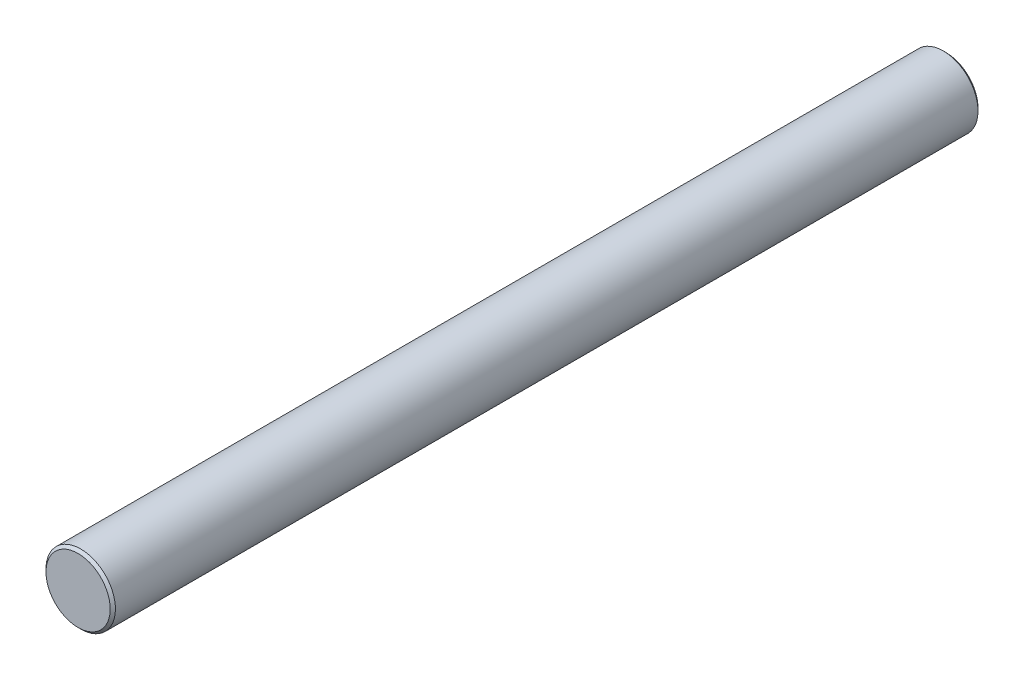
ISO-10303-21;
HEADER;
FILE_DESCRIPTION(('STEP AP214'),'2;1');
FILE_NAME('part.step','',(''),(''),'','','');
FILE_SCHEMA(('AUTOMOTIVE_DESIGN { 1 0 10303 214 1 1 1 1 }'));
ENDSEC;
DATA;
#1=APPLICATION_CONTEXT('core data for automotive mechanical design processes');
#2=APPLICATION_PROTOCOL_DEFINITION('international standard','automotive_design',2000,#1);
#3=PRODUCT_CONTEXT('',#1,'mechanical');
#4=PRODUCT('Part','Part','',(#3));
#5=PRODUCT_RELATED_PRODUCT_CATEGORY('part','',(#4));
#6=PRODUCT_DEFINITION_FORMATION('','',#4);
#7=PRODUCT_DEFINITION_CONTEXT('part definition',#1,'design');
#8=PRODUCT_DEFINITION('design','',#6,#7);
#9=PRODUCT_DEFINITION_SHAPE('','',#8);
#10=(LENGTH_UNIT() NAMED_UNIT(*) SI_UNIT(.MILLI.,.METRE.));
#11=(NAMED_UNIT(*) PLANE_ANGLE_UNIT() SI_UNIT($,.RADIAN.));
#12=(NAMED_UNIT(*) SI_UNIT($,.STERADIAN.) SOLID_ANGLE_UNIT());
#13=UNCERTAINTY_MEASURE_WITH_UNIT(LENGTH_MEASURE(1.E-05),#10,'distance_accuracy_value','');
#14=(GEOMETRIC_REPRESENTATION_CONTEXT(3) GLOBAL_UNCERTAINTY_ASSIGNED_CONTEXT((#13)) GLOBAL_UNIT_ASSIGNED_CONTEXT((#10,
#11,#12)) REPRESENTATION_CONTEXT('',''));
#15=CARTESIAN_POINT('',(0.,0.,0.));
#16=DIRECTION('',(0.,0.,1.));
#17=DIRECTION('',(1.,0.,0.));
#18=AXIS2_PLACEMENT_3D('',#15,#16,#17);
#19=CARTESIAN_POINT('',(0.,9.25,0.));
#20=DIRECTION('',(0.,0.,-1.));
#21=DIRECTION('',(0.,1.,0.));
#22=AXIS2_PLACEMENT_3D('',#19,#20,#21);
#23=PLANE('',#22);
#24=CARTESIAN_POINT('',(0.,0.,0.));
#25=DIRECTION('',(0.,0.,-1.));
#26=DIRECTION('',(0.,1.,0.));
#27=AXIS2_PLACEMENT_3D('',#24,#25,#26);
#28=CIRCLE('',#27,18.5);
#29=CARTESIAN_POINT('',(0.,18.5,0.));
#30=VERTEX_POINT('',#29);
#31=EDGE_CURVE('E9',#30,#30,#28,.T.);
#32=ORIENTED_EDGE('',*,*,#31,.T.);
#33=EDGE_LOOP('',(#32));
#34=FACE_BOUND('',#33,.T.);
#35=CARTESIAN_POINT('',(0.,0.,0.));
#36=DIRECTION('',(0.,0.,1.));
#37=DIRECTION('',(-1.,0.,0.));
#38=AXIS2_PLACEMENT_3D('',#35,#36,#37);
#39=CIRCLE('',#38,6.);
#40=CARTESIAN_POINT('',(-6.,0.,0.));
#41=VERTEX_POINT('',#40);
#42=EDGE_CURVE('E52',#41,#41,#39,.T.);
#43=ORIENTED_EDGE('',*,*,#42,.T.);
#44=EDGE_LOOP('',(#43));
#45=FACE_BOUND('',#44,.T.);
#46=ADVANCED_FACE('F15',(#34,#45),#23,.T.);
#47=CARTESIAN_POINT('',(0.,0.,0.75));
#48=DIRECTION('',(0.,0.,1.));
#49=DIRECTION('',(0.,1.,0.));
#50=AXIS2_PLACEMENT_3D('',#47,#48,#49);
#51=CONICAL_SURFACE('',#50,19.25,0.785398163397448);
#52=CARTESIAN_POINT('',(0.,0.,1.5));
#53=DIRECTION('',(0.,0.,-1.));
#54=DIRECTION('',(0.,1.,0.));
#55=AXIS2_PLACEMENT_3D('',#52,#53,#54);
#56=CIRCLE('',#55,20.);
#57=CARTESIAN_POINT('',(0.,20.,1.5));
#58=VERTEX_POINT('',#57);
#59=EDGE_CURVE('E25',#58,#58,#56,.T.);
#60=ORIENTED_EDGE('',*,*,#59,.T.);
#61=EDGE_LOOP('',(#60));
#62=FACE_BOUND('',#61,.T.);
#63=ORIENTED_EDGE('',*,*,#31,.F.);
#64=EDGE_LOOP('',(#63));
#65=FACE_BOUND('',#64,.T.);
#66=ADVANCED_FACE('F120',(#62,#65),#51,.T.);
#67=CARTESIAN_POINT('',(0.,0.,250.));
#68=DIRECTION('',(0.,0.,1.));
#69=DIRECTION('',(0.,1.,0.));
#70=AXIS2_PLACEMENT_3D('',#67,#68,#69);
#71=CYLINDRICAL_SURFACE('',#70,20.);
#72=CARTESIAN_POINT('',(0.,0.,498.5));
#73=DIRECTION('',(0.,0.,-1.));
#74=DIRECTION('',(0.,1.,0.));
#75=AXIS2_PLACEMENT_3D('',#72,#73,#74);
#76=CIRCLE('',#75,20.);
#77=CARTESIAN_POINT('',(0.,20.,498.5));
#78=VERTEX_POINT('',#77);
#79=EDGE_CURVE('E19',#78,#78,#76,.T.);
#80=ORIENTED_EDGE('',*,*,#79,.T.);
#81=EDGE_LOOP('',(#80));
#82=FACE_BOUND('',#81,.T.);
#83=ORIENTED_EDGE('',*,*,#59,.F.);
#84=EDGE_LOOP('',(#83));
#85=FACE_BOUND('',#84,.T.);
#86=CARTESIAN_POINT('',(0.,0.,6.5));
#87=DIRECTION('',(0.,0.,-1.));
#88=DIRECTION('',(0.,1.,0.));
#89=AXIS2_PLACEMENT_3D('',#86,#87,#88);
#90=CIRCLE('',#89,20.);
#91=CARTESIAN_POINT('',(10.5356537528527,-17.,6.5));
#92=VERTEX_POINT('',#91);
#93=CARTESIAN_POINT('',(-10.5356537528527,-17.,6.5));
#94=VERTEX_POINT('',#93);
#95=EDGE_CURVE('E69',#92,#94,#90,.T.);
#96=ORIENTED_EDGE('',*,*,#95,.T.);
#97=DIRECTION('',(0.,0.,1.));
#98=VECTOR('',#97,1.);
#99=CARTESIAN_POINT('',(-10.5356537528527,-17.,8.25));
#100=LINE('',#99,#98);
#101=CARTESIAN_POINT('',(-10.5356537528527,-17.,10.));
#102=VERTEX_POINT('',#101);
#103=EDGE_CURVE('E62',#94,#102,#100,.T.);
#104=ORIENTED_EDGE('',*,*,#103,.T.);
#105=CARTESIAN_POINT('',(0.,0.,10.));
#106=DIRECTION('',(0.,0.,1.));
#107=DIRECTION('',(0.,1.,0.));
#108=AXIS2_PLACEMENT_3D('',#105,#106,#107);
#109=CIRCLE('',#108,20.);
#110=CARTESIAN_POINT('',(10.5356537528527,-17.,10.));
#111=VERTEX_POINT('',#110);
#112=EDGE_CURVE('E75',#102,#111,#109,.T.);
#113=ORIENTED_EDGE('',*,*,#112,.T.);
#114=DIRECTION('',(0.,0.,-1.));
#115=VECTOR('',#114,1.);
#116=CARTESIAN_POINT('',(10.5356537528527,-17.,8.25));
#117=LINE('',#116,#115);
#118=EDGE_CURVE('E60',#111,#92,#117,.T.);
#119=ORIENTED_EDGE('',*,*,#118,.T.);
#120=EDGE_LOOP('',(#96,#104,#113,#119));
#121=FACE_BOUND('',#120,.T.);
#122=ADVANCED_FACE('F17',(#82,#85,#121),#71,.T.);
#123=CARTESIAN_POINT('',(0.,0.,499.25));
#124=DIRECTION('',(0.,0.,-1.));
#125=DIRECTION('',(0.,1.,0.));
#126=AXIS2_PLACEMENT_3D('',#123,#124,#125);
#127=CONICAL_SURFACE('',#126,19.25,0.785398163397448);
#128=CARTESIAN_POINT('',(0.,0.,500.));
#129=DIRECTION('',(0.,0.,-1.));
#130=DIRECTION('',(0.,1.,0.));
#131=AXIS2_PLACEMENT_3D('',#128,#129,#130);
#132=CIRCLE('',#131,18.5);
#133=CARTESIAN_POINT('',(0.,18.5,500.));
#134=VERTEX_POINT('',#133);
#135=EDGE_CURVE('E44',#134,#134,#132,.T.);
#136=ORIENTED_EDGE('',*,*,#135,.T.);
#137=EDGE_LOOP('',(#136));
#138=FACE_BOUND('',#137,.T.);
#139=ORIENTED_EDGE('',*,*,#79,.F.);
#140=EDGE_LOOP('',(#139));
#141=FACE_BOUND('',#140,.T.);
#142=ADVANCED_FACE('F116',(#138,#141),#127,.T.);
#143=CARTESIAN_POINT('',(0.,9.25,500.));
#144=DIRECTION('',(0.,0.,1.));
#145=DIRECTION('',(0.,-1.,0.));
#146=AXIS2_PLACEMENT_3D('',#143,#144,#145);
#147=PLANE('',#146);
#148=ORIENTED_EDGE('',*,*,#135,.F.);
#149=EDGE_LOOP('',(#148));
#150=FACE_BOUND('',#149,.T.);
#151=ADVANCED_FACE('F110',(#150),#147,.T.);
#152=CARTESIAN_POINT('',(0.,0.,26.4586213285198));
#153=DIRECTION('',(0.,0.,-1.));
#154=DIRECTION('',(-1.,0.,0.));
#155=AXIS2_PLACEMENT_3D('',#152,#153,#154);
#156=CONICAL_SURFACE('',#155,2.52640625,1.0471975511966);
#157=CARTESIAN_POINT('',(0.,0.,25.));
#158=DIRECTION('',(0.,0.,1.));
#159=DIRECTION('',(-1.,0.,0.));
#160=AXIS2_PLACEMENT_3D('',#157,#158,#159);
#161=CIRCLE('',#160,5.0528125);
#162=CARTESIAN_POINT('',(-5.0528125,0.,25.));
#163=VERTEX_POINT('',#162);
#164=EDGE_CURVE('E51',#163,#163,#161,.T.);
#165=ORIENTED_EDGE('',*,*,#164,.F.);
#166=EDGE_LOOP('',(#165));
#167=FACE_BOUND('',#166,.T.);
#168=CARTESIAN_POINT('',(0.,0.,27.9172426570397));
#169=VERTEX_POINT('',#168);
#170=VERTEX_LOOP('',#169);
#171=FACE_BOUND('',#170,.T.);
#172=ADVANCED_FACE('F104',(#167,#171),#156,.F.);
#173=CARTESIAN_POINT('',(0.,0.,12.97359375));
#174=DIRECTION('',(0.,0.,-1.));
#175=DIRECTION('',(-1.,0.,0.));
#176=AXIS2_PLACEMENT_3D('',#173,#174,#175);
#177=CYLINDRICAL_SURFACE('',#176,5.0528125);
#178=CARTESIAN_POINT('',(0.,0.,0.9471875));
#179=DIRECTION('',(0.,0.,1.));
#180=DIRECTION('',(-1.,0.,0.));
#181=AXIS2_PLACEMENT_3D('',#178,#179,#180);
#182=CIRCLE('',#181,5.0528125);
#183=CARTESIAN_POINT('',(-5.0528125,0.,0.9471875));
#184=VERTEX_POINT('',#183);
#185=EDGE_CURVE('E57',#184,#184,#182,.T.);
#186=ORIENTED_EDGE('',*,*,#185,.F.);
#187=EDGE_LOOP('',(#186));
#188=FACE_BOUND('',#187,.T.);
#189=ORIENTED_EDGE('',*,*,#164,.T.);
#190=EDGE_LOOP('',(#189));
#191=FACE_BOUND('',#190,.T.);
#192=ADVANCED_FACE('F101',(#188,#191),#177,.F.);
#193=CARTESIAN_POINT('',(0.,0.,0.47359375));
#194=DIRECTION('',(0.,0.,-1.));
#195=DIRECTION('',(-1.,0.,0.));
#196=AXIS2_PLACEMENT_3D('',#193,#194,#195);
#197=CONICAL_SURFACE('',#196,5.52640625,0.785398163397448);
#198=ORIENTED_EDGE('',*,*,#42,.F.);
#199=EDGE_LOOP('',(#198));
#200=FACE_BOUND('',#199,.T.);
#201=ORIENTED_EDGE('',*,*,#185,.T.);
#202=EDGE_LOOP('',(#201));
#203=FACE_BOUND('',#202,.T.);
#204=ADVANCED_FACE('F99',(#200,#203),#197,.F.);
#205=CARTESIAN_POINT('',(0.,-17.,8.25));
#206=DIRECTION('',(0.,-1.,0.));
#207=DIRECTION('',(0.,0.,-1.));
#208=AXIS2_PLACEMENT_3D('',#205,#206,#207);
#209=PLANE('',#208);
#210=ORIENTED_EDGE('',*,*,#103,.F.);
#211=DIRECTION('',(1.,0.,0.));
#212=VECTOR('',#211,1.);
#213=CARTESIAN_POINT('',(0.,-17.,6.5));
#214=LINE('',#213,#212);
#215=EDGE_CURVE('E66',#94,#92,#214,.T.);
#216=ORIENTED_EDGE('',*,*,#215,.T.);
#217=ORIENTED_EDGE('',*,*,#118,.F.);
#218=DIRECTION('',(-1.,0.,0.));
#219=VECTOR('',#218,1.);
#220=CARTESIAN_POINT('',(0.,-17.,10.));
#221=LINE('',#220,#219);
#222=EDGE_CURVE('E72',#111,#102,#221,.T.);
#223=ORIENTED_EDGE('',*,*,#222,.T.);
#224=EDGE_LOOP('',(#210,#216,#217,#223));
#225=FACE_BOUND('',#224,.T.);
#226=ADVANCED_FACE('F179',(#225),#209,.T.);
#227=CARTESIAN_POINT('',(0.,-19.5,6.5));
#228=DIRECTION('',(0.,0.,1.));
#229=DIRECTION('',(1.,0.,0.));
#230=AXIS2_PLACEMENT_3D('',#227,#228,#229);
#231=PLANE('',#230);
#232=ORIENTED_EDGE('',*,*,#95,.F.);
#233=ORIENTED_EDGE('',*,*,#215,.F.);
#234=EDGE_LOOP('',(#232,#233));
#235=FACE_BOUND('',#234,.T.);
#236=ADVANCED_FACE('F188',(#235),#231,.T.);
#237=CARTESIAN_POINT('',(0.,-19.5,10.));
#238=DIRECTION('',(0.,0.,1.));
#239=DIRECTION('',(1.,0.,0.));
#240=AXIS2_PLACEMENT_3D('',#237,#238,#239);
#241=PLANE('',#240);
#242=ORIENTED_EDGE('',*,*,#112,.F.);
#243=ORIENTED_EDGE('',*,*,#222,.F.);
#244=EDGE_LOOP('',(#242,#243));
#245=FACE_BOUND('',#244,.T.);
#246=ADVANCED_FACE('F87',(#245),#241,.F.);
#247=CLOSED_SHELL('',(#46,#66,#122,#142,#151,#172,#192,#204,#226,#236,#246));
#248=MANIFOLD_SOLID_BREP('B1',#247);
#249=ADVANCED_BREP_SHAPE_REPRESENTATION('',(#18,#248),#14);
#250=SHAPE_DEFINITION_REPRESENTATION(#9,#249);
ENDSEC;
END-ISO-10303-21;
